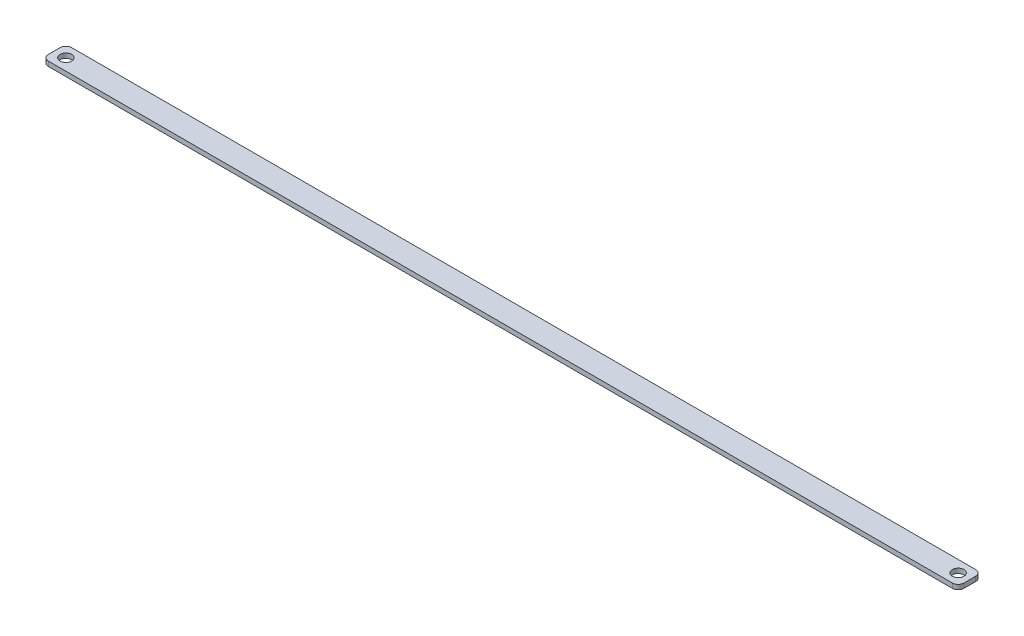
ISO-10303-21;
HEADER;
FILE_DESCRIPTION(('STEP AP214'),'2;1');
FILE_NAME('part.step','',(''),(''),'','','');
FILE_SCHEMA(('AUTOMOTIVE_DESIGN { 1 0 10303 214 1 1 1 1 }'));
ENDSEC;
DATA;
#1=APPLICATION_CONTEXT('core data for automotive mechanical design processes');
#2=APPLICATION_PROTOCOL_DEFINITION('international standard','automotive_design',2000,#1);
#3=PRODUCT_CONTEXT('',#1,'mechanical');
#4=PRODUCT('Part','Part','',(#3));
#5=PRODUCT_RELATED_PRODUCT_CATEGORY('part','',(#4));
#6=PRODUCT_DEFINITION_FORMATION('','',#4);
#7=PRODUCT_DEFINITION_CONTEXT('part definition',#1,'design');
#8=PRODUCT_DEFINITION('design','',#6,#7);
#9=PRODUCT_DEFINITION_SHAPE('','',#8);
#10=(LENGTH_UNIT() NAMED_UNIT(*) SI_UNIT(.MILLI.,.METRE.));
#11=(NAMED_UNIT(*) PLANE_ANGLE_UNIT() SI_UNIT($,.RADIAN.));
#12=(NAMED_UNIT(*) SI_UNIT($,.STERADIAN.) SOLID_ANGLE_UNIT());
#13=UNCERTAINTY_MEASURE_WITH_UNIT(LENGTH_MEASURE(1.E-05),#10,'distance_accuracy_value','');
#14=(GEOMETRIC_REPRESENTATION_CONTEXT(3) GLOBAL_UNCERTAINTY_ASSIGNED_CONTEXT((#13)) GLOBAL_UNIT_ASSIGNED_CONTEXT((#10,
#11,#12)) REPRESENTATION_CONTEXT('',''));
#15=CARTESIAN_POINT('',(0.,0.,0.));
#16=DIRECTION('',(0.,0.,1.));
#17=DIRECTION('',(1.,0.,0.));
#18=AXIS2_PLACEMENT_3D('',#15,#16,#17);
#19=CARTESIAN_POINT('',(220.641688413608,2.,-5.));
#20=DIRECTION('',(0.,-1.,0.));
#21=DIRECTION('',(0.,0.,-1.));
#22=AXIS2_PLACEMENT_3D('',#19,#20,#21);
#23=CYLINDRICAL_SURFACE('',#22,2.5);
#24=CARTESIAN_POINT('',(220.641688413608,0.,-5.));
#25=DIRECTION('',(0.,1.,0.));
#26=DIRECTION('',(0.,0.,1.));
#27=AXIS2_PLACEMENT_3D('',#24,#25,#26);
#28=CIRCLE('',#27,2.5);
#29=CARTESIAN_POINT('',(220.641688413608,0.,-2.5));
#30=VERTEX_POINT('',#29);
#31=EDGE_CURVE('E220',#30,#30,#28,.T.);
#32=ORIENTED_EDGE('',*,*,#31,.F.);
#33=EDGE_LOOP('',(#32));
#34=FACE_BOUND('',#33,.T.);
#35=CARTESIAN_POINT('',(220.641688413608,2.,-5.));
#36=DIRECTION('',(0.,1.,0.));
#37=DIRECTION('',(0.,0.,1.));
#38=AXIS2_PLACEMENT_3D('',#35,#36,#37);
#39=CIRCLE('',#38,2.5);
#40=CARTESIAN_POINT('',(220.641688413608,2.,-2.5));
#41=VERTEX_POINT('',#40);
#42=EDGE_CURVE('E13',#41,#41,#39,.T.);
#43=ORIENTED_EDGE('',*,*,#42,.T.);
#44=EDGE_LOOP('',(#43));
#45=FACE_BOUND('',#44,.T.);
#46=ADVANCED_FACE('F93',(#34,#45),#23,.F.);
#47=CARTESIAN_POINT('',(-162.358311586392,2.,-5.));
#48=DIRECTION('',(0.,-1.,0.));
#49=DIRECTION('',(0.,0.,-1.));
#50=AXIS2_PLACEMENT_3D('',#47,#48,#49);
#51=CYLINDRICAL_SURFACE('',#50,2.5);
#52=CARTESIAN_POINT('',(-162.358311586392,0.,-5.));
#53=DIRECTION('',(0.,1.,0.));
#54=DIRECTION('',(0.,0.,1.));
#55=AXIS2_PLACEMENT_3D('',#52,#53,#54);
#56=CIRCLE('',#55,2.5);
#57=CARTESIAN_POINT('',(-162.358311586392,0.,-2.5));
#58=VERTEX_POINT('',#57);
#59=EDGE_CURVE('E233',#58,#58,#56,.T.);
#60=ORIENTED_EDGE('',*,*,#59,.F.);
#61=EDGE_LOOP('',(#60));
#62=FACE_BOUND('',#61,.T.);
#63=CARTESIAN_POINT('',(-162.358311586392,2.,-5.));
#64=DIRECTION('',(0.,1.,0.));
#65=DIRECTION('',(0.,0.,1.));
#66=AXIS2_PLACEMENT_3D('',#63,#64,#65);
#67=CIRCLE('',#66,2.5);
#68=CARTESIAN_POINT('',(-162.358311586392,2.,-2.5));
#69=VERTEX_POINT('',#68);
#70=EDGE_CURVE('E103',#69,#69,#67,.T.);
#71=ORIENTED_EDGE('',*,*,#70,.T.);
#72=EDGE_LOOP('',(#71));
#73=FACE_BOUND('',#72,.T.);
#74=ADVANCED_FACE('F254',(#62,#73),#51,.F.);
#75=CARTESIAN_POINT('',(47.5,2.,-2.5));
#76=DIRECTION('',(0.,1.,0.));
#77=DIRECTION('',(0.,0.,1.));
#78=AXIS2_PLACEMENT_3D('',#75,#76,#77);
#79=PLANE('',#78);
#80=DIRECTION('',(1.,0.,0.));
#81=VECTOR('',#80,1.);
#82=CARTESIAN_POINT('',(-164.858311586392,2.,0.));
#83=LINE('',#82,#81);
#84=CARTESIAN_POINT('',(-164.858311586392,2.,0.));
#85=VERTEX_POINT('',#84);
#86=CARTESIAN_POINT('',(223.141688413608,2.,0.));
#87=VERTEX_POINT('',#86);
#88=EDGE_CURVE('E156',#85,#87,#83,.T.);
#89=ORIENTED_EDGE('',*,*,#88,.T.);
#90=CARTESIAN_POINT('',(223.141688413608,2.,-2.5));
#91=DIRECTION('',(0.,1.,0.));
#92=DIRECTION('',(0.,0.,1.));
#93=AXIS2_PLACEMENT_3D('',#90,#91,#92);
#94=CIRCLE('',#93,2.5);
#95=CARTESIAN_POINT('',(225.641688413608,2.,-2.50000000000002));
#96=VERTEX_POINT('',#95);
#97=EDGE_CURVE('E162',#87,#96,#94,.T.);
#98=ORIENTED_EDGE('',*,*,#97,.T.);
#99=DIRECTION('',(0.,0.,-1.));
#100=VECTOR('',#99,1.);
#101=CARTESIAN_POINT('',(225.641688413608,2.,-2.50000000000002));
#102=LINE('',#101,#100);
#103=CARTESIAN_POINT('',(225.641688413608,2.,-7.49999999999998));
#104=VERTEX_POINT('',#103);
#105=EDGE_CURVE('E184',#96,#104,#102,.T.);
#106=ORIENTED_EDGE('',*,*,#105,.T.);
#107=CARTESIAN_POINT('',(223.141688413608,2.,-7.5));
#108=DIRECTION('',(0.,1.,0.));
#109=DIRECTION('',(0.,0.,-1.));
#110=AXIS2_PLACEMENT_3D('',#107,#108,#109);
#111=CIRCLE('',#110,2.5);
#112=CARTESIAN_POINT('',(223.141688413608,2.,-10.));
#113=VERTEX_POINT('',#112);
#114=EDGE_CURVE('E188',#104,#113,#111,.T.);
#115=ORIENTED_EDGE('',*,*,#114,.T.);
#116=DIRECTION('',(-1.,0.,0.));
#117=VECTOR('',#116,1.);
#118=CARTESIAN_POINT('',(178.141688413608,2.,-10.));
#119=LINE('',#118,#117);
#120=CARTESIAN_POINT('',(-164.858311586392,2.,-10.));
#121=VERTEX_POINT('',#120);
#122=EDGE_CURVE('E242',#113,#121,#119,.T.);
#123=ORIENTED_EDGE('',*,*,#122,.T.);
#124=CARTESIAN_POINT('',(-164.858311586392,2.,-7.5));
#125=DIRECTION('',(0.,1.,0.));
#126=DIRECTION('',(0.,0.,-1.));
#127=AXIS2_PLACEMENT_3D('',#124,#125,#126);
#128=CIRCLE('',#127,2.5);
#129=CARTESIAN_POINT('',(-167.358311586392,2.,-7.49999999999998));
#130=VERTEX_POINT('',#129);
#131=EDGE_CURVE('E168',#121,#130,#128,.T.);
#132=ORIENTED_EDGE('',*,*,#131,.T.);
#133=DIRECTION('',(0.,0.,1.));
#134=VECTOR('',#133,1.);
#135=CARTESIAN_POINT('',(-167.358311586392,2.,-2.50000000000002));
#136=LINE('',#135,#134);
#137=CARTESIAN_POINT('',(-167.358311586392,2.,-2.50000000000002));
#138=VERTEX_POINT('',#137);
#139=EDGE_CURVE('E186',#130,#138,#136,.T.);
#140=ORIENTED_EDGE('',*,*,#139,.T.);
#141=CARTESIAN_POINT('',(-164.858311586392,2.,-2.5));
#142=DIRECTION('',(0.,1.,0.));
#143=DIRECTION('',(0.,0.,-1.));
#144=AXIS2_PLACEMENT_3D('',#141,#142,#143);
#145=CIRCLE('',#144,2.5);
#146=EDGE_CURVE('E165',#138,#85,#145,.T.);
#147=ORIENTED_EDGE('',*,*,#146,.T.);
#148=EDGE_LOOP('',(#89,#98,#106,#115,#123,#132,#140,#147));
#149=FACE_BOUND('',#148,.T.);
#150=ORIENTED_EDGE('',*,*,#42,.F.);
#151=EDGE_LOOP('',(#150));
#152=FACE_BOUND('',#151,.T.);
#153=ORIENTED_EDGE('',*,*,#70,.F.);
#154=EDGE_LOOP('',(#153));
#155=FACE_BOUND('',#154,.T.);
#156=ADVANCED_FACE('F158',(#149,#152,#155),#79,.T.);
#157=CARTESIAN_POINT('',(223.141688413608,0.,-2.5));
#158=DIRECTION('',(0.,1.,0.));
#159=DIRECTION('',(0.,0.,1.));
#160=AXIS2_PLACEMENT_3D('',#157,#158,#159);
#161=PLANE('',#160);
#162=ORIENTED_EDGE('',*,*,#31,.T.);
#163=EDGE_LOOP('',(#162));
#164=FACE_BOUND('',#163,.T.);
#165=CARTESIAN_POINT('',(223.141688413608,0.,-2.5));
#166=DIRECTION('',(0.,1.,0.));
#167=DIRECTION('',(0.,0.,1.));
#168=AXIS2_PLACEMENT_3D('',#165,#166,#167);
#169=CIRCLE('',#168,2.5);
#170=CARTESIAN_POINT('',(223.141688413608,0.,0.));
#171=VERTEX_POINT('',#170);
#172=CARTESIAN_POINT('',(225.641688413608,0.,-2.50000000000002));
#173=VERTEX_POINT('',#172);
#174=EDGE_CURVE('E177',#171,#173,#169,.T.);
#175=ORIENTED_EDGE('',*,*,#174,.F.);
#176=DIRECTION('',(1.,0.,0.));
#177=VECTOR('',#176,1.);
#178=CARTESIAN_POINT('',(-164.858311586392,0.,0.));
#179=LINE('',#178,#177);
#180=CARTESIAN_POINT('',(-164.858311586392,0.,0.));
#181=VERTEX_POINT('',#180);
#182=EDGE_CURVE('E173',#181,#171,#179,.T.);
#183=ORIENTED_EDGE('',*,*,#182,.F.);
#184=CARTESIAN_POINT('',(-164.858311586392,0.,-2.5));
#185=DIRECTION('',(0.,1.,0.));
#186=DIRECTION('',(0.,0.,-1.));
#187=AXIS2_PLACEMENT_3D('',#184,#185,#186);
#188=CIRCLE('',#187,2.5);
#189=CARTESIAN_POINT('',(-167.358311586392,0.,-2.50000000000002));
#190=VERTEX_POINT('',#189);
#191=EDGE_CURVE('E199',#190,#181,#188,.T.);
#192=ORIENTED_EDGE('',*,*,#191,.F.);
#193=DIRECTION('',(0.,0.,1.));
#194=VECTOR('',#193,1.);
#195=CARTESIAN_POINT('',(-167.358311586392,0.,-2.50000000000002));
#196=LINE('',#195,#194);
#197=CARTESIAN_POINT('',(-167.358311586392,0.,-7.49999999999998));
#198=VERTEX_POINT('',#197);
#199=EDGE_CURVE('E206',#198,#190,#196,.T.);
#200=ORIENTED_EDGE('',*,*,#199,.F.);
#201=CARTESIAN_POINT('',(-164.858311586392,0.,-7.5));
#202=DIRECTION('',(0.,1.,0.));
#203=DIRECTION('',(0.,0.,-1.));
#204=AXIS2_PLACEMENT_3D('',#201,#202,#203);
#205=CIRCLE('',#204,2.5);
#206=CARTESIAN_POINT('',(-164.858311586392,0.,-10.));
#207=VERTEX_POINT('',#206);
#208=EDGE_CURVE('E212',#207,#198,#205,.T.);
#209=ORIENTED_EDGE('',*,*,#208,.F.);
#210=DIRECTION('',(-1.,0.,0.));
#211=VECTOR('',#210,1.);
#212=CARTESIAN_POINT('',(178.141688413608,0.,-10.));
#213=LINE('',#212,#211);
#214=CARTESIAN_POINT('',(223.141688413608,0.,-10.));
#215=VERTEX_POINT('',#214);
#216=EDGE_CURVE('E218',#215,#207,#213,.T.);
#217=ORIENTED_EDGE('',*,*,#216,.F.);
#218=CARTESIAN_POINT('',(223.141688413608,0.,-7.5));
#219=DIRECTION('',(0.,1.,0.));
#220=DIRECTION('',(0.,0.,-1.));
#221=AXIS2_PLACEMENT_3D('',#218,#219,#220);
#222=CIRCLE('',#221,2.5);
#223=CARTESIAN_POINT('',(225.641688413608,0.,-7.49999999999998));
#224=VERTEX_POINT('',#223);
#225=EDGE_CURVE('E223',#224,#215,#222,.T.);
#226=ORIENTED_EDGE('',*,*,#225,.F.);
#227=DIRECTION('',(0.,0.,-1.));
#228=VECTOR('',#227,1.);
#229=CARTESIAN_POINT('',(225.641688413608,0.,-2.50000000000002));
#230=LINE('',#229,#228);
#231=EDGE_CURVE('E178',#173,#224,#230,.T.);
#232=ORIENTED_EDGE('',*,*,#231,.F.);
#233=EDGE_LOOP('',(#175,#183,#192,#200,#209,#217,#226,#232));
#234=FACE_BOUND('',#233,.T.);
#235=ORIENTED_EDGE('',*,*,#59,.T.);
#236=EDGE_LOOP('',(#235));
#237=FACE_BOUND('',#236,.T.);
#238=ADVANCED_FACE('F249',(#164,#234,#237),#161,.F.);
#239=CARTESIAN_POINT('',(178.141688413608,2.,-10.));
#240=DIRECTION('',(0.,0.,1.));
#241=DIRECTION('',(1.,0.,0.));
#242=AXIS2_PLACEMENT_3D('',#239,#240,#241);
#243=PLANE('',#242);
#244=ORIENTED_EDGE('',*,*,#216,.T.);
#245=DIRECTION('',(0.,-1.,0.));
#246=VECTOR('',#245,1.);
#247=CARTESIAN_POINT('',(-164.858311586392,2.,-10.));
#248=LINE('',#247,#246);
#249=EDGE_CURVE('E209',#121,#207,#248,.T.);
#250=ORIENTED_EDGE('',*,*,#249,.F.);
#251=ORIENTED_EDGE('',*,*,#122,.F.);
#252=DIRECTION('',(0.,-1.,0.));
#253=VECTOR('',#252,1.);
#254=CARTESIAN_POINT('',(223.141688413608,2.,-10.));
#255=LINE('',#254,#253);
#256=EDGE_CURVE('E112',#113,#215,#255,.T.);
#257=ORIENTED_EDGE('',*,*,#256,.T.);
#258=EDGE_LOOP('',(#244,#250,#251,#257));
#259=FACE_BOUND('',#258,.T.);
#260=ADVANCED_FACE('F271',(#259),#243,.F.);
#261=CARTESIAN_POINT('',(178.141688413608,2.,0.));
#262=DIRECTION('',(0.,0.,-1.));
#263=DIRECTION('',(-1.,0.,0.));
#264=AXIS2_PLACEMENT_3D('',#261,#262,#263);
#265=PLANE('',#264);
#266=DIRECTION('',(0.,-1.,0.));
#267=VECTOR('',#266,1.);
#268=CARTESIAN_POINT('',(223.141688413608,2.,0.));
#269=LINE('',#268,#267);
#270=EDGE_CURVE('E171',#87,#171,#269,.T.);
#271=ORIENTED_EDGE('',*,*,#270,.F.);
#272=ORIENTED_EDGE('',*,*,#88,.F.);
#273=DIRECTION('',(0.,-1.,0.));
#274=VECTOR('',#273,1.);
#275=CARTESIAN_POINT('',(-164.858311586392,2.,0.));
#276=LINE('',#275,#274);
#277=EDGE_CURVE('E196',#85,#181,#276,.T.);
#278=ORIENTED_EDGE('',*,*,#277,.T.);
#279=ORIENTED_EDGE('',*,*,#182,.T.);
#280=EDGE_LOOP('',(#271,#272,#278,#279));
#281=FACE_BOUND('',#280,.T.);
#282=ADVANCED_FACE('F172',(#281),#265,.F.);
#283=CARTESIAN_POINT('',(223.141688413608,2.,-2.5));
#284=DIRECTION('',(0.,-1.,0.));
#285=DIRECTION('',(0.,0.,-1.));
#286=AXIS2_PLACEMENT_3D('',#283,#284,#285);
#287=CYLINDRICAL_SURFACE('',#286,2.5);
#288=ORIENTED_EDGE('',*,*,#174,.T.);
#289=DIRECTION('',(0.,-1.,0.));
#290=VECTOR('',#289,1.);
#291=CARTESIAN_POINT('',(225.641688413608,2.,-2.50000000000002));
#292=LINE('',#291,#290);
#293=EDGE_CURVE('E182',#96,#173,#292,.T.);
#294=ORIENTED_EDGE('',*,*,#293,.F.);
#295=ORIENTED_EDGE('',*,*,#97,.F.);
#296=ORIENTED_EDGE('',*,*,#270,.T.);
#297=EDGE_LOOP('',(#288,#294,#295,#296));
#298=FACE_BOUND('',#297,.T.);
#299=ADVANCED_FACE('F180',(#298),#287,.T.);
#300=CARTESIAN_POINT('',(225.641688413608,2.,-2.50000000000002));
#301=DIRECTION('',(-1.,0.,0.));
#302=DIRECTION('',(0.,0.,1.));
#303=AXIS2_PLACEMENT_3D('',#300,#301,#302);
#304=PLANE('',#303);
#305=ORIENTED_EDGE('',*,*,#231,.T.);
#306=DIRECTION('',(0.,-1.,0.));
#307=VECTOR('',#306,1.);
#308=CARTESIAN_POINT('',(225.641688413608,2.,-7.49999999999998));
#309=LINE('',#308,#307);
#310=EDGE_CURVE('E215',#104,#224,#309,.T.);
#311=ORIENTED_EDGE('',*,*,#310,.F.);
#312=ORIENTED_EDGE('',*,*,#105,.F.);
#313=ORIENTED_EDGE('',*,*,#293,.T.);
#314=EDGE_LOOP('',(#305,#311,#312,#313));
#315=FACE_BOUND('',#314,.T.);
#316=ADVANCED_FACE('F278',(#315),#304,.F.);
#317=CARTESIAN_POINT('',(223.141688413608,2.,-7.5));
#318=DIRECTION('',(0.,-1.,0.));
#319=DIRECTION('',(0.,0.,-1.));
#320=AXIS2_PLACEMENT_3D('',#317,#318,#319);
#321=CYLINDRICAL_SURFACE('',#320,2.5);
#322=ORIENTED_EDGE('',*,*,#225,.T.);
#323=ORIENTED_EDGE('',*,*,#256,.F.);
#324=ORIENTED_EDGE('',*,*,#114,.F.);
#325=ORIENTED_EDGE('',*,*,#310,.T.);
#326=EDGE_LOOP('',(#322,#323,#324,#325));
#327=FACE_BOUND('',#326,.T.);
#328=ADVANCED_FACE('F281',(#327),#321,.T.);
#329=CARTESIAN_POINT('',(-164.858311586392,2.,-7.5));
#330=DIRECTION('',(0.,-1.,0.));
#331=DIRECTION('',(0.,0.,-1.));
#332=AXIS2_PLACEMENT_3D('',#329,#330,#331);
#333=CYLINDRICAL_SURFACE('',#332,2.5);
#334=ORIENTED_EDGE('',*,*,#208,.T.);
#335=DIRECTION('',(0.,-1.,0.));
#336=VECTOR('',#335,1.);
#337=CARTESIAN_POINT('',(-167.358311586392,2.,-7.49999999999998));
#338=LINE('',#337,#336);
#339=EDGE_CURVE('E202',#130,#198,#338,.T.);
#340=ORIENTED_EDGE('',*,*,#339,.F.);
#341=ORIENTED_EDGE('',*,*,#131,.F.);
#342=ORIENTED_EDGE('',*,*,#249,.T.);
#343=EDGE_LOOP('',(#334,#340,#341,#342));
#344=FACE_BOUND('',#343,.T.);
#345=ADVANCED_FACE('F285',(#344),#333,.T.);
#346=CARTESIAN_POINT('',(-167.358311586392,2.,-2.50000000000002));
#347=DIRECTION('',(1.,0.,0.));
#348=DIRECTION('',(0.,0.,-1.));
#349=AXIS2_PLACEMENT_3D('',#346,#347,#348);
#350=PLANE('',#349);
#351=ORIENTED_EDGE('',*,*,#199,.T.);
#352=DIRECTION('',(0.,-1.,0.));
#353=VECTOR('',#352,1.);
#354=CARTESIAN_POINT('',(-167.358311586392,2.,-2.50000000000002));
#355=LINE('',#354,#353);
#356=EDGE_CURVE('E203',#138,#190,#355,.T.);
#357=ORIENTED_EDGE('',*,*,#356,.F.);
#358=ORIENTED_EDGE('',*,*,#139,.F.);
#359=ORIENTED_EDGE('',*,*,#339,.T.);
#360=EDGE_LOOP('',(#351,#357,#358,#359));
#361=FACE_BOUND('',#360,.T.);
#362=ADVANCED_FACE('F288',(#361),#350,.F.);
#363=CARTESIAN_POINT('',(-164.858311586392,2.,-2.5));
#364=DIRECTION('',(0.,-1.,0.));
#365=DIRECTION('',(0.,0.,-1.));
#366=AXIS2_PLACEMENT_3D('',#363,#364,#365);
#367=CYLINDRICAL_SURFACE('',#366,2.5);
#368=ORIENTED_EDGE('',*,*,#191,.T.);
#369=ORIENTED_EDGE('',*,*,#277,.F.);
#370=ORIENTED_EDGE('',*,*,#146,.F.);
#371=ORIENTED_EDGE('',*,*,#356,.T.);
#372=EDGE_LOOP('',(#368,#369,#370,#371));
#373=FACE_BOUND('',#372,.T.);
#374=ADVANCED_FACE('F95',(#373),#367,.T.);
#375=CLOSED_SHELL('',(#46,#74,#156,#238,#260,#282,#299,#316,#328,#345,#362,#374));
#376=MANIFOLD_SOLID_BREP('B2',#375);
#377=ADVANCED_BREP_SHAPE_REPRESENTATION('',(#18,#376),#14);
#378=SHAPE_DEFINITION_REPRESENTATION(#9,#377);
ENDSEC;
END-ISO-10303-21;
